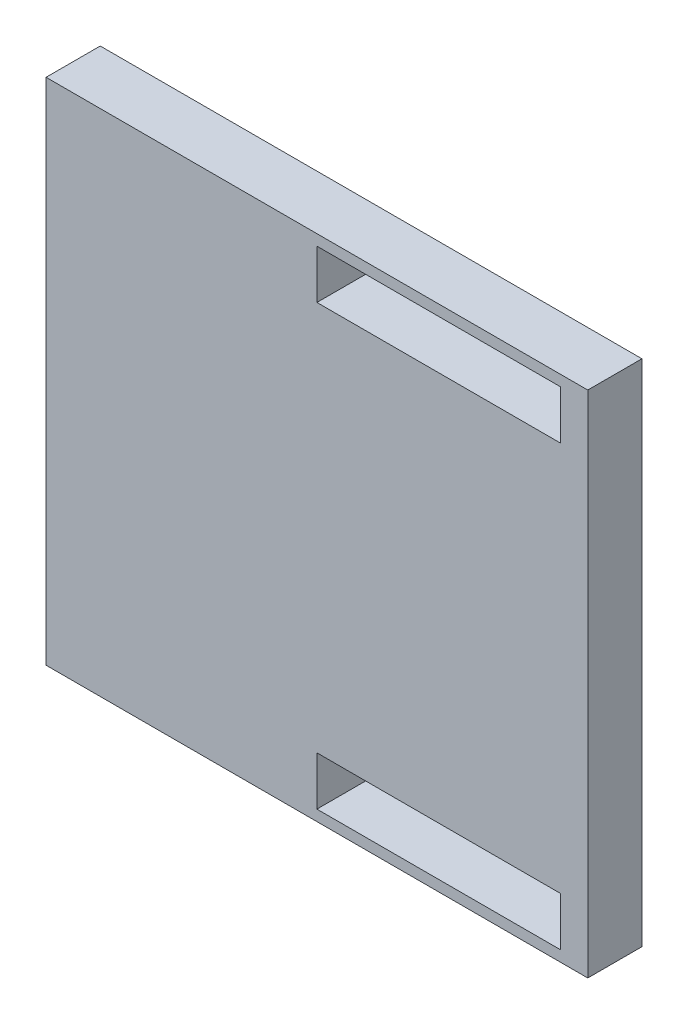
ISO-10303-21;
HEADER;
FILE_DESCRIPTION(('STEP AP214'),'2;1');
FILE_NAME('part.step','',(''),(''),'','','');
FILE_SCHEMA(('AUTOMOTIVE_DESIGN { 1 0 10303 214 1 1 1 1 }'));
ENDSEC;
DATA;
#1=APPLICATION_CONTEXT('core data for automotive mechanical design processes');
#2=APPLICATION_PROTOCOL_DEFINITION('international standard','automotive_design',2000,#1);
#3=PRODUCT_CONTEXT('',#1,'mechanical');
#4=PRODUCT('Part','Part','',(#3));
#5=PRODUCT_RELATED_PRODUCT_CATEGORY('part','',(#4));
#6=PRODUCT_DEFINITION_FORMATION('','',#4);
#7=PRODUCT_DEFINITION_CONTEXT('part definition',#1,'design');
#8=PRODUCT_DEFINITION('design','',#6,#7);
#9=PRODUCT_DEFINITION_SHAPE('','',#8);
#10=(LENGTH_UNIT() NAMED_UNIT(*) SI_UNIT(.MILLI.,.METRE.));
#11=(NAMED_UNIT(*) PLANE_ANGLE_UNIT() SI_UNIT($,.RADIAN.));
#12=(NAMED_UNIT(*) SI_UNIT($,.STERADIAN.) SOLID_ANGLE_UNIT());
#13=UNCERTAINTY_MEASURE_WITH_UNIT(LENGTH_MEASURE(1.E-05),#10,'distance_accuracy_value','');
#14=(GEOMETRIC_REPRESENTATION_CONTEXT(3) GLOBAL_UNCERTAINTY_ASSIGNED_CONTEXT((#13)) GLOBAL_UNIT_ASSIGNED_CONTEXT((#10,
#11,#12)) REPRESENTATION_CONTEXT('',''));
#15=CARTESIAN_POINT('',(0.,0.,0.));
#16=DIRECTION('',(0.,0.,1.));
#17=DIRECTION('',(1.,0.,0.));
#18=AXIS2_PLACEMENT_3D('',#15,#16,#17);
#19=CARTESIAN_POINT('',(0.,0.,10.));
#20=DIRECTION('',(1.,0.,0.));
#21=DIRECTION('',(0.,1.,0.));
#22=AXIS2_PLACEMENT_3D('',#19,#20,#21);
#23=PLANE('',#22);
#24=DIRECTION('',(0.,-1.,0.));
#25=VECTOR('',#24,1.);
#26=CARTESIAN_POINT('',(0.,0.,0.));
#27=LINE('',#26,#25);
#28=CARTESIAN_POINT('',(0.,0.,0.));
#29=VERTEX_POINT('',#28);
#30=CARTESIAN_POINT('',(0.,-94.,0.));
#31=VERTEX_POINT('',#30);
#32=EDGE_CURVE('E182',#29,#31,#27,.T.);
#33=ORIENTED_EDGE('',*,*,#32,.T.);
#34=DIRECTION('',(0.,0.,-1.));
#35=VECTOR('',#34,1.);
#36=CARTESIAN_POINT('',(0.,-94.,10.));
#37=LINE('',#36,#35);
#38=CARTESIAN_POINT('',(0.,-94.,10.));
#39=VERTEX_POINT('',#38);
#40=EDGE_CURVE('E11',#39,#31,#37,.T.);
#41=ORIENTED_EDGE('',*,*,#40,.F.);
#42=DIRECTION('',(0.,-1.,0.));
#43=VECTOR('',#42,1.);
#44=CARTESIAN_POINT('',(0.,0.,10.));
#45=LINE('',#44,#43);
#46=CARTESIAN_POINT('',(0.,0.,10.));
#47=VERTEX_POINT('',#46);
#48=EDGE_CURVE('E229',#47,#39,#45,.T.);
#49=ORIENTED_EDGE('',*,*,#48,.F.);
#50=DIRECTION('',(0.,0.,-1.));
#51=VECTOR('',#50,1.);
#52=CARTESIAN_POINT('',(0.,0.,10.));
#53=LINE('',#52,#51);
#54=EDGE_CURVE('E243',#47,#29,#53,.T.);
#55=ORIENTED_EDGE('',*,*,#54,.T.);
#56=EDGE_LOOP('',(#33,#41,#49,#55));
#57=FACE_BOUND('',#56,.T.);
#58=ADVANCED_FACE('F45',(#57),#23,.F.);
#59=CARTESIAN_POINT('',(0.,-94.,10.));
#60=DIRECTION('',(0.,1.,0.));
#61=DIRECTION('',(0.,0.,1.));
#62=AXIS2_PLACEMENT_3D('',#59,#60,#61);
#63=PLANE('',#62);
#64=DIRECTION('',(1.,0.,0.));
#65=VECTOR('',#64,1.);
#66=CARTESIAN_POINT('',(0.,-94.,0.));
#67=LINE('',#66,#65);
#68=CARTESIAN_POINT('',(100.,-94.,0.));
#69=VERTEX_POINT('',#68);
#70=EDGE_CURVE('E247',#31,#69,#67,.T.);
#71=ORIENTED_EDGE('',*,*,#70,.T.);
#72=DIRECTION('',(0.,0.,-1.));
#73=VECTOR('',#72,1.);
#74=CARTESIAN_POINT('',(100.,-94.,10.));
#75=LINE('',#74,#73);
#76=CARTESIAN_POINT('',(100.,-94.,10.));
#77=VERTEX_POINT('',#76);
#78=EDGE_CURVE('E53',#77,#69,#75,.T.);
#79=ORIENTED_EDGE('',*,*,#78,.F.);
#80=DIRECTION('',(1.,0.,0.));
#81=VECTOR('',#80,1.);
#82=CARTESIAN_POINT('',(0.,-94.,10.));
#83=LINE('',#82,#81);
#84=EDGE_CURVE('E233',#39,#77,#83,.T.);
#85=ORIENTED_EDGE('',*,*,#84,.F.);
#86=ORIENTED_EDGE('',*,*,#40,.T.);
#87=EDGE_LOOP('',(#71,#79,#85,#86));
#88=FACE_BOUND('',#87,.T.);
#89=ADVANCED_FACE('F282',(#88),#63,.F.);
#90=CARTESIAN_POINT('',(100.,0.,10.));
#91=DIRECTION('',(-1.,0.,0.));
#92=DIRECTION('',(0.,0.,1.));
#93=AXIS2_PLACEMENT_3D('',#90,#91,#92);
#94=PLANE('',#93);
#95=DIRECTION('',(0.,1.,0.));
#96=VECTOR('',#95,1.);
#97=CARTESIAN_POINT('',(100.,0.,0.));
#98=LINE('',#97,#96);
#99=CARTESIAN_POINT('',(100.,0.,0.));
#100=VERTEX_POINT('',#99);
#101=EDGE_CURVE('E250',#69,#100,#98,.T.);
#102=ORIENTED_EDGE('',*,*,#101,.T.);
#103=DIRECTION('',(0.,0.,-1.));
#104=VECTOR('',#103,1.);
#105=CARTESIAN_POINT('',(100.,0.,10.));
#106=LINE('',#105,#104);
#107=CARTESIAN_POINT('',(100.,0.,10.));
#108=VERTEX_POINT('',#107);
#109=EDGE_CURVE('E258',#108,#100,#106,.T.);
#110=ORIENTED_EDGE('',*,*,#109,.F.);
#111=DIRECTION('',(0.,1.,0.));
#112=VECTOR('',#111,1.);
#113=CARTESIAN_POINT('',(100.,0.,10.));
#114=LINE('',#113,#112);
#115=EDGE_CURVE('E237',#77,#108,#114,.T.);
#116=ORIENTED_EDGE('',*,*,#115,.F.);
#117=ORIENTED_EDGE('',*,*,#78,.T.);
#118=EDGE_LOOP('',(#102,#110,#116,#117));
#119=FACE_BOUND('',#118,.T.);
#120=ADVANCED_FACE('F267',(#119),#94,.F.);
#121=CARTESIAN_POINT('',(0.,0.,10.));
#122=DIRECTION('',(0.,-1.,0.));
#123=DIRECTION('',(0.,0.,-1.));
#124=AXIS2_PLACEMENT_3D('',#121,#122,#123);
#125=PLANE('',#124);
#126=DIRECTION('',(-1.,0.,0.));
#127=VECTOR('',#126,1.);
#128=CARTESIAN_POINT('',(0.,0.,0.));
#129=LINE('',#128,#127);
#130=EDGE_CURVE('E234',#100,#29,#129,.T.);
#131=ORIENTED_EDGE('',*,*,#130,.T.);
#132=ORIENTED_EDGE('',*,*,#54,.F.);
#133=DIRECTION('',(-1.,0.,0.));
#134=VECTOR('',#133,1.);
#135=CARTESIAN_POINT('',(0.,0.,10.));
#136=LINE('',#135,#134);
#137=EDGE_CURVE('E240',#108,#47,#136,.T.);
#138=ORIENTED_EDGE('',*,*,#137,.F.);
#139=ORIENTED_EDGE('',*,*,#109,.T.);
#140=EDGE_LOOP('',(#131,#132,#138,#139));
#141=FACE_BOUND('',#140,.T.);
#142=ADVANCED_FACE('F276',(#141),#125,.F.);
#143=CARTESIAN_POINT('',(0.,0.,10.));
#144=DIRECTION('',(0.,0.,1.));
#145=DIRECTION('',(1.,0.,0.));
#146=AXIS2_PLACEMENT_3D('',#143,#144,#145);
#147=PLANE('',#146);
#148=DIRECTION('',(0.,-1.,0.));
#149=VECTOR('',#148,1.);
#150=CARTESIAN_POINT('',(95.,-83.,10.));
#151=LINE('',#150,#149);
#152=CARTESIAN_POINT('',(95.,-83.,10.));
#153=VERTEX_POINT('',#152);
#154=CARTESIAN_POINT('',(95.,-92.,10.));
#155=VERTEX_POINT('',#154);
#156=EDGE_CURVE('E138',#153,#155,#151,.T.);
#157=ORIENTED_EDGE('',*,*,#156,.T.);
#158=DIRECTION('',(-1.,0.,0.));
#159=VECTOR('',#158,1.);
#160=CARTESIAN_POINT('',(95.,-92.,10.));
#161=LINE('',#160,#159);
#162=CARTESIAN_POINT('',(50.,-92.,10.));
#163=VERTEX_POINT('',#162);
#164=EDGE_CURVE('E150',#155,#163,#161,.T.);
#165=ORIENTED_EDGE('',*,*,#164,.T.);
#166=DIRECTION('',(0.,1.,0.));
#167=VECTOR('',#166,1.);
#168=CARTESIAN_POINT('',(50.,-83.,10.));
#169=LINE('',#168,#167);
#170=CARTESIAN_POINT('',(50.,-83.,10.));
#171=VERTEX_POINT('',#170);
#172=EDGE_CURVE('E60',#163,#171,#169,.T.);
#173=ORIENTED_EDGE('',*,*,#172,.T.);
#174=DIRECTION('',(1.,0.,0.));
#175=VECTOR('',#174,1.);
#176=CARTESIAN_POINT('',(95.,-83.,10.));
#177=LINE('',#176,#175);
#178=EDGE_CURVE('E147',#171,#153,#177,.T.);
#179=ORIENTED_EDGE('',*,*,#178,.T.);
#180=EDGE_LOOP('',(#157,#165,#173,#179));
#181=FACE_BOUND('',#180,.T.);
#182=DIRECTION('',(0.,-1.,0.));
#183=VECTOR('',#182,1.);
#184=CARTESIAN_POINT('',(95.,-2.,10.));
#185=LINE('',#184,#183);
#186=CARTESIAN_POINT('',(95.,-2.,10.));
#187=VERTEX_POINT('',#186);
#188=CARTESIAN_POINT('',(95.,-11.,10.));
#189=VERTEX_POINT('',#188);
#190=EDGE_CURVE('E207',#187,#189,#185,.T.);
#191=ORIENTED_EDGE('',*,*,#190,.T.);
#192=DIRECTION('',(-1.,0.,0.));
#193=VECTOR('',#192,1.);
#194=CARTESIAN_POINT('',(95.,-11.,10.));
#195=LINE('',#194,#193);
#196=CARTESIAN_POINT('',(50.,-11.,10.));
#197=VERTEX_POINT('',#196);
#198=EDGE_CURVE('E222',#189,#197,#195,.T.);
#199=ORIENTED_EDGE('',*,*,#198,.T.);
#200=DIRECTION('',(0.,1.,0.));
#201=VECTOR('',#200,1.);
#202=CARTESIAN_POINT('',(50.,-2.,10.));
#203=LINE('',#202,#201);
#204=CARTESIAN_POINT('',(50.,-2.,10.));
#205=VERTEX_POINT('',#204);
#206=EDGE_CURVE('E68',#197,#205,#203,.T.);
#207=ORIENTED_EDGE('',*,*,#206,.T.);
#208=DIRECTION('',(1.,0.,0.));
#209=VECTOR('',#208,1.);
#210=CARTESIAN_POINT('',(95.,-2.,10.));
#211=LINE('',#210,#209);
#212=EDGE_CURVE('E192',#205,#187,#211,.T.);
#213=ORIENTED_EDGE('',*,*,#212,.T.);
#214=EDGE_LOOP('',(#191,#199,#207,#213));
#215=FACE_BOUND('',#214,.T.);
#216=ORIENTED_EDGE('',*,*,#48,.T.);
#217=ORIENTED_EDGE('',*,*,#84,.T.);
#218=ORIENTED_EDGE('',*,*,#115,.T.);
#219=ORIENTED_EDGE('',*,*,#137,.T.);
#220=EDGE_LOOP('',(#216,#217,#218,#219));
#221=FACE_BOUND('',#220,.T.);
#222=ADVANCED_FACE('F155',(#181,#215,#221),#147,.T.);
#223=CARTESIAN_POINT('',(0.,0.,0.));
#224=DIRECTION('',(0.,0.,1.));
#225=DIRECTION('',(1.,0.,0.));
#226=AXIS2_PLACEMENT_3D('',#223,#224,#225);
#227=PLANE('',#226);
#228=DIRECTION('',(-1.,0.,0.));
#229=VECTOR('',#228,1.);
#230=CARTESIAN_POINT('',(95.,-92.,0.));
#231=LINE('',#230,#229);
#232=CARTESIAN_POINT('',(95.,-92.,0.));
#233=VERTEX_POINT('',#232);
#234=CARTESIAN_POINT('',(50.,-92.,0.));
#235=VERTEX_POINT('',#234);
#236=EDGE_CURVE('E172',#233,#235,#231,.T.);
#237=ORIENTED_EDGE('',*,*,#236,.F.);
#238=DIRECTION('',(0.,-1.,0.));
#239=VECTOR('',#238,1.);
#240=CARTESIAN_POINT('',(95.,-83.,0.));
#241=LINE('',#240,#239);
#242=CARTESIAN_POINT('',(95.,-83.,0.));
#243=VERTEX_POINT('',#242);
#244=EDGE_CURVE('E141',#243,#233,#241,.T.);
#245=ORIENTED_EDGE('',*,*,#244,.F.);
#246=DIRECTION('',(1.,0.,0.));
#247=VECTOR('',#246,1.);
#248=CARTESIAN_POINT('',(95.,-83.,0.));
#249=LINE('',#248,#247);
#250=CARTESIAN_POINT('',(50.,-83.,0.));
#251=VERTEX_POINT('',#250);
#252=EDGE_CURVE('E159',#251,#243,#249,.T.);
#253=ORIENTED_EDGE('',*,*,#252,.F.);
#254=DIRECTION('',(0.,1.,0.));
#255=VECTOR('',#254,1.);
#256=CARTESIAN_POINT('',(50.,-83.,0.));
#257=LINE('',#256,#255);
#258=EDGE_CURVE('E163',#235,#251,#257,.T.);
#259=ORIENTED_EDGE('',*,*,#258,.F.);
#260=EDGE_LOOP('',(#237,#245,#253,#259));
#261=FACE_BOUND('',#260,.T.);
#262=DIRECTION('',(-1.,0.,0.));
#263=VECTOR('',#262,1.);
#264=CARTESIAN_POINT('',(95.,-11.,0.));
#265=LINE('',#264,#263);
#266=CARTESIAN_POINT('',(95.,-11.,0.));
#267=VERTEX_POINT('',#266);
#268=CARTESIAN_POINT('',(50.,-11.,0.));
#269=VERTEX_POINT('',#268);
#270=EDGE_CURVE('E211',#267,#269,#265,.T.);
#271=ORIENTED_EDGE('',*,*,#270,.F.);
#272=DIRECTION('',(0.,-1.,0.));
#273=VECTOR('',#272,1.);
#274=CARTESIAN_POINT('',(95.,-2.,0.));
#275=LINE('',#274,#273);
#276=CARTESIAN_POINT('',(95.,-2.,0.));
#277=VERTEX_POINT('',#276);
#278=EDGE_CURVE('E173',#277,#267,#275,.T.);
#279=ORIENTED_EDGE('',*,*,#278,.F.);
#280=DIRECTION('',(1.,0.,0.));
#281=VECTOR('',#280,1.);
#282=CARTESIAN_POINT('',(95.,-2.,0.));
#283=LINE('',#282,#281);
#284=CARTESIAN_POINT('',(50.,-2.,0.));
#285=VERTEX_POINT('',#284);
#286=EDGE_CURVE('E202',#285,#277,#283,.T.);
#287=ORIENTED_EDGE('',*,*,#286,.F.);
#288=DIRECTION('',(0.,1.,0.));
#289=VECTOR('',#288,1.);
#290=CARTESIAN_POINT('',(50.,-2.,0.));
#291=LINE('',#290,#289);
#292=EDGE_CURVE('E206',#269,#285,#291,.T.);
#293=ORIENTED_EDGE('',*,*,#292,.F.);
#294=EDGE_LOOP('',(#271,#279,#287,#293));
#295=FACE_BOUND('',#294,.T.);
#296=ORIENTED_EDGE('',*,*,#32,.F.);
#297=ORIENTED_EDGE('',*,*,#130,.F.);
#298=ORIENTED_EDGE('',*,*,#101,.F.);
#299=ORIENTED_EDGE('',*,*,#70,.F.);
#300=EDGE_LOOP('',(#296,#297,#298,#299));
#301=FACE_BOUND('',#300,.T.);
#302=ADVANCED_FACE('F273',(#261,#295,#301),#227,.F.);
#303=CARTESIAN_POINT('',(95.,-2.,10.));
#304=DIRECTION('',(1.,0.,0.));
#305=DIRECTION('',(0.,0.,-1.));
#306=AXIS2_PLACEMENT_3D('',#303,#304,#305);
#307=PLANE('',#306);
#308=ORIENTED_EDGE('',*,*,#278,.T.);
#309=DIRECTION('',(0.,0.,-1.));
#310=VECTOR('',#309,1.);
#311=CARTESIAN_POINT('',(95.,-11.,10.));
#312=LINE('',#311,#310);
#313=EDGE_CURVE('E188',#189,#267,#312,.T.);
#314=ORIENTED_EDGE('',*,*,#313,.F.);
#315=ORIENTED_EDGE('',*,*,#190,.F.);
#316=DIRECTION('',(0.,0.,-1.));
#317=VECTOR('',#316,1.);
#318=CARTESIAN_POINT('',(95.,-2.,10.));
#319=LINE('',#318,#317);
#320=EDGE_CURVE('E199',#187,#277,#319,.T.);
#321=ORIENTED_EDGE('',*,*,#320,.T.);
#322=EDGE_LOOP('',(#308,#314,#315,#321));
#323=FACE_BOUND('',#322,.T.);
#324=ADVANCED_FACE('F294',(#323),#307,.F.);
#325=CARTESIAN_POINT('',(95.,-2.,10.));
#326=DIRECTION('',(0.,1.,0.));
#327=DIRECTION('',(0.,0.,1.));
#328=AXIS2_PLACEMENT_3D('',#325,#326,#327);
#329=PLANE('',#328);
#330=ORIENTED_EDGE('',*,*,#286,.T.);
#331=ORIENTED_EDGE('',*,*,#320,.F.);
#332=ORIENTED_EDGE('',*,*,#212,.F.);
#333=DIRECTION('',(0.,0.,-1.));
#334=VECTOR('',#333,1.);
#335=CARTESIAN_POINT('',(50.,-2.,10.));
#336=LINE('',#335,#334);
#337=EDGE_CURVE('E196',#205,#285,#336,.T.);
#338=ORIENTED_EDGE('',*,*,#337,.T.);
#339=EDGE_LOOP('',(#330,#331,#332,#338));
#340=FACE_BOUND('',#339,.T.);
#341=ADVANCED_FACE('F298',(#340),#329,.F.);
#342=CARTESIAN_POINT('',(50.,-2.,10.));
#343=DIRECTION('',(-1.,0.,0.));
#344=DIRECTION('',(0.,0.,1.));
#345=AXIS2_PLACEMENT_3D('',#342,#343,#344);
#346=PLANE('',#345);
#347=ORIENTED_EDGE('',*,*,#292,.T.);
#348=ORIENTED_EDGE('',*,*,#337,.F.);
#349=ORIENTED_EDGE('',*,*,#206,.F.);
#350=DIRECTION('',(0.,0.,-1.));
#351=VECTOR('',#350,1.);
#352=CARTESIAN_POINT('',(50.,-11.,10.));
#353=LINE('',#352,#351);
#354=EDGE_CURVE('E193',#197,#269,#353,.T.);
#355=ORIENTED_EDGE('',*,*,#354,.T.);
#356=EDGE_LOOP('',(#347,#348,#349,#355));
#357=FACE_BOUND('',#356,.T.);
#358=ADVANCED_FACE('F301',(#357),#346,.F.);
#359=CARTESIAN_POINT('',(95.,-11.,10.));
#360=DIRECTION('',(0.,-1.,0.));
#361=DIRECTION('',(0.,0.,-1.));
#362=AXIS2_PLACEMENT_3D('',#359,#360,#361);
#363=PLANE('',#362);
#364=ORIENTED_EDGE('',*,*,#270,.T.);
#365=ORIENTED_EDGE('',*,*,#354,.F.);
#366=ORIENTED_EDGE('',*,*,#198,.F.);
#367=ORIENTED_EDGE('',*,*,#313,.T.);
#368=EDGE_LOOP('',(#364,#365,#366,#367));
#369=FACE_BOUND('',#368,.T.);
#370=ADVANCED_FACE('F305',(#369),#363,.F.);
#371=CARTESIAN_POINT('',(95.,-83.,10.));
#372=DIRECTION('',(1.,0.,0.));
#373=DIRECTION('',(0.,0.,-1.));
#374=AXIS2_PLACEMENT_3D('',#371,#372,#373);
#375=PLANE('',#374);
#376=ORIENTED_EDGE('',*,*,#244,.T.);
#377=DIRECTION('',(0.,0.,-1.));
#378=VECTOR('',#377,1.);
#379=CARTESIAN_POINT('',(95.,-92.,10.));
#380=LINE('',#379,#378);
#381=EDGE_CURVE('E134',#155,#233,#380,.T.);
#382=ORIENTED_EDGE('',*,*,#381,.F.);
#383=ORIENTED_EDGE('',*,*,#156,.F.);
#384=DIRECTION('',(0.,0.,-1.));
#385=VECTOR('',#384,1.);
#386=CARTESIAN_POINT('',(95.,-83.,10.));
#387=LINE('',#386,#385);
#388=EDGE_CURVE('E179',#153,#243,#387,.T.);
#389=ORIENTED_EDGE('',*,*,#388,.T.);
#390=EDGE_LOOP('',(#376,#382,#383,#389));
#391=FACE_BOUND('',#390,.T.);
#392=ADVANCED_FACE('F136',(#391),#375,.F.);
#393=CARTESIAN_POINT('',(95.,-83.,10.));
#394=DIRECTION('',(0.,1.,0.));
#395=DIRECTION('',(0.,0.,1.));
#396=AXIS2_PLACEMENT_3D('',#393,#394,#395);
#397=PLANE('',#396);
#398=ORIENTED_EDGE('',*,*,#252,.T.);
#399=ORIENTED_EDGE('',*,*,#388,.F.);
#400=ORIENTED_EDGE('',*,*,#178,.F.);
#401=DIRECTION('',(0.,0.,-1.));
#402=VECTOR('',#401,1.);
#403=CARTESIAN_POINT('',(50.,-83.,10.));
#404=LINE('',#403,#402);
#405=EDGE_CURVE('E183',#171,#251,#404,.T.);
#406=ORIENTED_EDGE('',*,*,#405,.T.);
#407=EDGE_LOOP('',(#398,#399,#400,#406));
#408=FACE_BOUND('',#407,.T.);
#409=ADVANCED_FACE('F314',(#408),#397,.F.);
#410=CARTESIAN_POINT('',(50.,-83.,10.));
#411=DIRECTION('',(-1.,0.,0.));
#412=DIRECTION('',(0.,-1.,0.));
#413=AXIS2_PLACEMENT_3D('',#410,#411,#412);
#414=PLANE('',#413);
#415=ORIENTED_EDGE('',*,*,#258,.T.);
#416=ORIENTED_EDGE('',*,*,#405,.F.);
#417=ORIENTED_EDGE('',*,*,#172,.F.);
#418=DIRECTION('',(0.,0.,-1.));
#419=VECTOR('',#418,1.);
#420=CARTESIAN_POINT('',(50.,-92.,10.));
#421=LINE('',#420,#419);
#422=EDGE_CURVE('E146',#163,#235,#421,.T.);
#423=ORIENTED_EDGE('',*,*,#422,.T.);
#424=EDGE_LOOP('',(#415,#416,#417,#423));
#425=FACE_BOUND('',#424,.T.);
#426=ADVANCED_FACE('F317',(#425),#414,.F.);
#427=CARTESIAN_POINT('',(95.,-92.,10.));
#428=DIRECTION('',(0.,-1.,0.));
#429=DIRECTION('',(0.,0.,-1.));
#430=AXIS2_PLACEMENT_3D('',#427,#428,#429);
#431=PLANE('',#430);
#432=ORIENTED_EDGE('',*,*,#236,.T.);
#433=ORIENTED_EDGE('',*,*,#422,.F.);
#434=ORIENTED_EDGE('',*,*,#164,.F.);
#435=ORIENTED_EDGE('',*,*,#381,.T.);
#436=EDGE_LOOP('',(#432,#433,#434,#435));
#437=FACE_BOUND('',#436,.T.);
#438=ADVANCED_FACE('F151',(#437),#431,.F.);
#439=CLOSED_SHELL('',(#58,#89,#120,#142,#222,#302,#324,#341,#358,#370,#392,#409,#426,#438));
#440=MANIFOLD_SOLID_BREP('B2',#439);
#441=ADVANCED_BREP_SHAPE_REPRESENTATION('',(#18,#440),#14);
#442=SHAPE_DEFINITION_REPRESENTATION(#9,#441);
ENDSEC;
END-ISO-10303-21;
